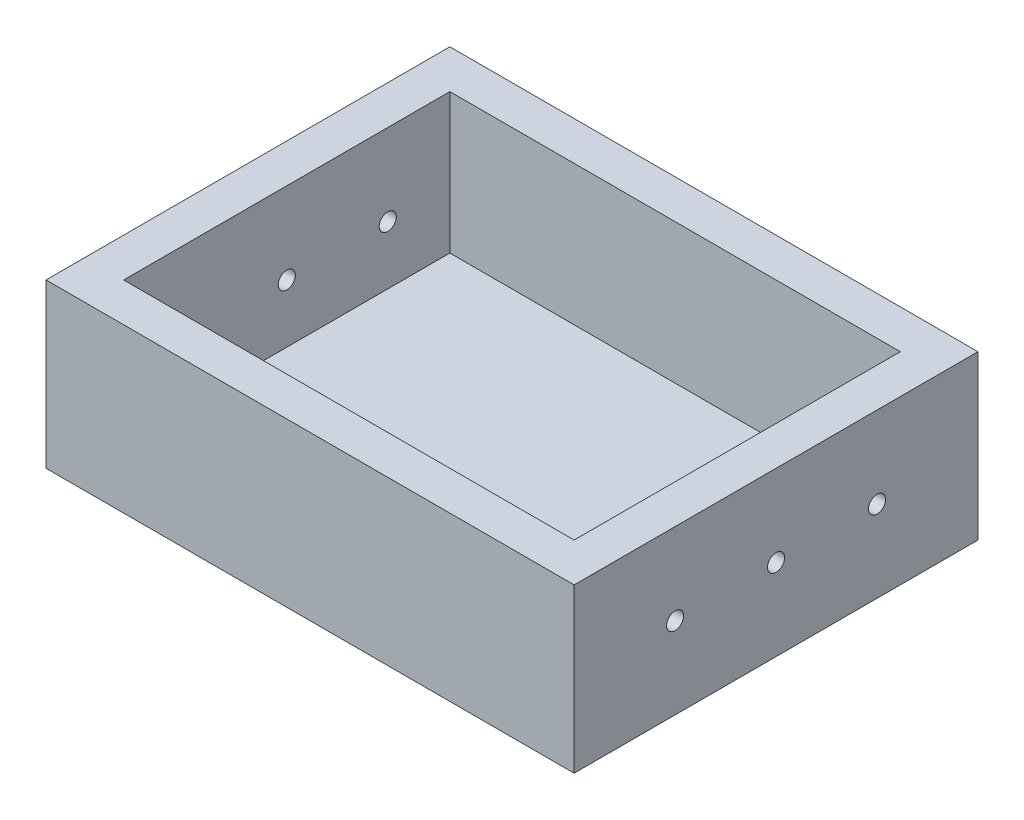
ISO-10303-21;
HEADER;
FILE_DESCRIPTION(('STEP AP214'),'2;1');
FILE_NAME('part.step','',(''),(''),'','','');
FILE_SCHEMA(('AUTOMOTIVE_DESIGN { 1 0 10303 214 1 1 1 1 }'));
ENDSEC;
DATA;
#1=APPLICATION_CONTEXT('core data for automotive mechanical design processes');
#2=APPLICATION_PROTOCOL_DEFINITION('international standard','automotive_design',2000,#1);
#3=PRODUCT_CONTEXT('',#1,'mechanical');
#4=PRODUCT('Part','Part','',(#3));
#5=PRODUCT_RELATED_PRODUCT_CATEGORY('part','',(#4));
#6=PRODUCT_DEFINITION_FORMATION('','',#4);
#7=PRODUCT_DEFINITION_CONTEXT('part definition',#1,'design');
#8=PRODUCT_DEFINITION('design','',#6,#7);
#9=PRODUCT_DEFINITION_SHAPE('','',#8);
#10=(LENGTH_UNIT() NAMED_UNIT(*) SI_UNIT(.MILLI.,.METRE.));
#11=(NAMED_UNIT(*) PLANE_ANGLE_UNIT() SI_UNIT($,.RADIAN.));
#12=(NAMED_UNIT(*) SI_UNIT($,.STERADIAN.) SOLID_ANGLE_UNIT());
#13=UNCERTAINTY_MEASURE_WITH_UNIT(LENGTH_MEASURE(1.E-05),#10,'distance_accuracy_value','');
#14=(GEOMETRIC_REPRESENTATION_CONTEXT(3) GLOBAL_UNCERTAINTY_ASSIGNED_CONTEXT((#13)) GLOBAL_UNIT_ASSIGNED_CONTEXT((#10,
#11,#12)) REPRESENTATION_CONTEXT('',''));
#15=CARTESIAN_POINT('',(0.,0.,0.));
#16=DIRECTION('',(0.,0.,1.));
#17=DIRECTION('',(1.,0.,0.));
#18=AXIS2_PLACEMENT_3D('',#15,#16,#17);
#19=CARTESIAN_POINT('',(68.,42.,-52.));
#20=DIRECTION('',(-1.,0.,0.));
#21=DIRECTION('',(0.,0.,1.));
#22=AXIS2_PLACEMENT_3D('',#19,#20,#21);
#23=PLANE('',#22);
#24=CARTESIAN_POINT('',(68.,21.,-26.));
#25=DIRECTION('',(-1.,0.,0.));
#26=DIRECTION('',(0.,0.,1.));
#27=AXIS2_PLACEMENT_3D('',#24,#25,#26);
#28=CIRCLE('',#27,2.2);
#29=CARTESIAN_POINT('',(68.,21.,-23.8));
#30=VERTEX_POINT('',#29);
#31=EDGE_CURVE('E180',#30,#30,#28,.T.);
#32=ORIENTED_EDGE('',*,*,#31,.T.);
#33=EDGE_LOOP('',(#32));
#34=FACE_BOUND('',#33,.T.);
#35=CARTESIAN_POINT('',(68.,21.,26.));
#36=DIRECTION('',(-1.,0.,0.));
#37=DIRECTION('',(0.,0.,1.));
#38=AXIS2_PLACEMENT_3D('',#35,#36,#37);
#39=CIRCLE('',#38,2.2);
#40=CARTESIAN_POINT('',(68.,21.,28.2));
#41=VERTEX_POINT('',#40);
#42=EDGE_CURVE('E198',#41,#41,#39,.T.);
#43=ORIENTED_EDGE('',*,*,#42,.T.);
#44=EDGE_LOOP('',(#43));
#45=FACE_BOUND('',#44,.T.);
#46=CARTESIAN_POINT('',(68.,21.,0.));
#47=DIRECTION('',(-1.,0.,0.));
#48=DIRECTION('',(0.,0.,1.));
#49=AXIS2_PLACEMENT_3D('',#46,#47,#48);
#50=CIRCLE('',#49,2.2);
#51=CARTESIAN_POINT('',(68.,21.,2.19999999999999));
#52=VERTEX_POINT('',#51);
#53=EDGE_CURVE('E192',#52,#52,#50,.T.);
#54=ORIENTED_EDGE('',*,*,#53,.T.);
#55=EDGE_LOOP('',(#54));
#56=FACE_BOUND('',#55,.T.);
#57=DIRECTION('',(0.,0.,-1.));
#58=VECTOR('',#57,1.);
#59=CARTESIAN_POINT('',(68.,0.,-52.));
#60=LINE('',#59,#58);
#61=CARTESIAN_POINT('',(68.,0.,52.));
#62=VERTEX_POINT('',#61);
#63=CARTESIAN_POINT('',(68.,0.,-52.));
#64=VERTEX_POINT('',#63);
#65=EDGE_CURVE('E154',#62,#64,#60,.T.);
#66=ORIENTED_EDGE('',*,*,#65,.T.);
#67=DIRECTION('',(0.,-1.,0.));
#68=VECTOR('',#67,1.);
#69=CARTESIAN_POINT('',(68.,42.,-52.));
#70=LINE('',#69,#68);
#71=CARTESIAN_POINT('',(68.,42.,-52.));
#72=VERTEX_POINT('',#71);
#73=EDGE_CURVE('E11',#72,#64,#70,.T.);
#74=ORIENTED_EDGE('',*,*,#73,.F.);
#75=DIRECTION('',(0.,0.,-1.));
#76=VECTOR('',#75,1.);
#77=CARTESIAN_POINT('',(68.,42.,-52.));
#78=LINE('',#77,#76);
#79=CARTESIAN_POINT('',(68.,42.,52.));
#80=VERTEX_POINT('',#79);
#81=EDGE_CURVE('E158',#80,#72,#78,.T.);
#82=ORIENTED_EDGE('',*,*,#81,.F.);
#83=DIRECTION('',(0.,-1.,0.));
#84=VECTOR('',#83,1.);
#85=CARTESIAN_POINT('',(68.,42.,52.));
#86=LINE('',#85,#84);
#87=EDGE_CURVE('E164',#80,#62,#86,.T.);
#88=ORIENTED_EDGE('',*,*,#87,.T.);
#89=EDGE_LOOP('',(#66,#74,#82,#88));
#90=FACE_BOUND('',#89,.T.);
#91=ADVANCED_FACE('F41',(#34,#45,#56,#90),#23,.F.);
#92=CARTESIAN_POINT('',(-68.,42.,-52.));
#93=DIRECTION('',(0.,0.,1.));
#94=DIRECTION('',(1.,0.,0.));
#95=AXIS2_PLACEMENT_3D('',#92,#93,#94);
#96=PLANE('',#95);
#97=DIRECTION('',(-1.,0.,0.));
#98=VECTOR('',#97,1.);
#99=CARTESIAN_POINT('',(-68.,0.,-52.));
#100=LINE('',#99,#98);
#101=CARTESIAN_POINT('',(-68.,0.,-52.));
#102=VERTEX_POINT('',#101);
#103=EDGE_CURVE('E167',#64,#102,#100,.T.);
#104=ORIENTED_EDGE('',*,*,#103,.T.);
#105=DIRECTION('',(0.,-1.,0.));
#106=VECTOR('',#105,1.);
#107=CARTESIAN_POINT('',(-68.,42.,-52.));
#108=LINE('',#107,#106);
#109=CARTESIAN_POINT('',(-68.,42.,-52.));
#110=VERTEX_POINT('',#109);
#111=EDGE_CURVE('E49',#110,#102,#108,.T.);
#112=ORIENTED_EDGE('',*,*,#111,.F.);
#113=DIRECTION('',(-1.,0.,0.));
#114=VECTOR('',#113,1.);
#115=CARTESIAN_POINT('',(-68.,42.,-52.));
#116=LINE('',#115,#114);
#117=EDGE_CURVE('E94',#72,#110,#116,.T.);
#118=ORIENTED_EDGE('',*,*,#117,.F.);
#119=ORIENTED_EDGE('',*,*,#73,.T.);
#120=EDGE_LOOP('',(#104,#112,#118,#119));
#121=FACE_BOUND('',#120,.T.);
#122=ADVANCED_FACE('F240',(#121),#96,.F.);
#123=CARTESIAN_POINT('',(-68.,42.,-52.));
#124=DIRECTION('',(1.,0.,0.));
#125=DIRECTION('',(0.,0.,-1.));
#126=AXIS2_PLACEMENT_3D('',#123,#124,#125);
#127=PLANE('',#126);
#128=CARTESIAN_POINT('',(-68.,21.,-26.));
#129=DIRECTION('',(-1.,0.,0.));
#130=DIRECTION('',(0.,0.,1.));
#131=AXIS2_PLACEMENT_3D('',#128,#129,#130);
#132=CIRCLE('',#131,2.2);
#133=CARTESIAN_POINT('',(-68.,21.,-23.8));
#134=VERTEX_POINT('',#133);
#135=EDGE_CURVE('E204',#134,#134,#132,.T.);
#136=ORIENTED_EDGE('',*,*,#135,.F.);
#137=EDGE_LOOP('',(#136));
#138=FACE_BOUND('',#137,.T.);
#139=CARTESIAN_POINT('',(-68.,21.,26.));
#140=DIRECTION('',(-1.,0.,0.));
#141=DIRECTION('',(0.,0.,1.));
#142=AXIS2_PLACEMENT_3D('',#139,#140,#141);
#143=CIRCLE('',#142,2.2);
#144=CARTESIAN_POINT('',(-68.,21.,28.2));
#145=VERTEX_POINT('',#144);
#146=EDGE_CURVE('E201',#145,#145,#143,.T.);
#147=ORIENTED_EDGE('',*,*,#146,.F.);
#148=EDGE_LOOP('',(#147));
#149=FACE_BOUND('',#148,.T.);
#150=CARTESIAN_POINT('',(-68.,21.,0.));
#151=DIRECTION('',(-1.,0.,0.));
#152=DIRECTION('',(0.,0.,1.));
#153=AXIS2_PLACEMENT_3D('',#150,#151,#152);
#154=CIRCLE('',#153,2.2);
#155=CARTESIAN_POINT('',(-68.,21.,2.19999999999999));
#156=VERTEX_POINT('',#155);
#157=EDGE_CURVE('E195',#156,#156,#154,.T.);
#158=ORIENTED_EDGE('',*,*,#157,.F.);
#159=EDGE_LOOP('',(#158));
#160=FACE_BOUND('',#159,.T.);
#161=DIRECTION('',(0.,0.,1.));
#162=VECTOR('',#161,1.);
#163=CARTESIAN_POINT('',(-68.,0.,-52.));
#164=LINE('',#163,#162);
#165=CARTESIAN_POINT('',(-68.,0.,52.));
#166=VERTEX_POINT('',#165);
#167=EDGE_CURVE('E169',#102,#166,#164,.T.);
#168=ORIENTED_EDGE('',*,*,#167,.T.);
#169=DIRECTION('',(0.,-1.,0.));
#170=VECTOR('',#169,1.);
#171=CARTESIAN_POINT('',(-68.,42.,52.));
#172=LINE('',#171,#170);
#173=CARTESIAN_POINT('',(-68.,42.,52.));
#174=VERTEX_POINT('',#173);
#175=EDGE_CURVE('E173',#174,#166,#172,.T.);
#176=ORIENTED_EDGE('',*,*,#175,.F.);
#177=DIRECTION('',(0.,0.,1.));
#178=VECTOR('',#177,1.);
#179=CARTESIAN_POINT('',(-68.,42.,-52.));
#180=LINE('',#179,#178);
#181=EDGE_CURVE('E161',#110,#174,#180,.T.);
#182=ORIENTED_EDGE('',*,*,#181,.F.);
#183=ORIENTED_EDGE('',*,*,#111,.T.);
#184=EDGE_LOOP('',(#168,#176,#182,#183));
#185=FACE_BOUND('',#184,.T.);
#186=ADVANCED_FACE('F246',(#138,#149,#160,#185),#127,.F.);
#187=CARTESIAN_POINT('',(-68.,42.,52.));
#188=DIRECTION('',(0.,0.,-1.));
#189=DIRECTION('',(-1.,0.,0.));
#190=AXIS2_PLACEMENT_3D('',#187,#188,#189);
#191=PLANE('',#190);
#192=DIRECTION('',(1.,0.,0.));
#193=VECTOR('',#192,1.);
#194=CARTESIAN_POINT('',(-68.,0.,52.));
#195=LINE('',#194,#193);
#196=EDGE_CURVE('E87',#166,#62,#195,.T.);
#197=ORIENTED_EDGE('',*,*,#196,.T.);
#198=ORIENTED_EDGE('',*,*,#87,.F.);
#199=DIRECTION('',(1.,0.,0.));
#200=VECTOR('',#199,1.);
#201=CARTESIAN_POINT('',(-68.,42.,52.));
#202=LINE('',#201,#200);
#203=EDGE_CURVE('E66',#174,#80,#202,.T.);
#204=ORIENTED_EDGE('',*,*,#203,.F.);
#205=ORIENTED_EDGE('',*,*,#175,.T.);
#206=EDGE_LOOP('',(#197,#198,#204,#205));
#207=FACE_BOUND('',#206,.T.);
#208=ADVANCED_FACE('F250',(#207),#191,.F.);
#209=CARTESIAN_POINT('',(0.,42.,0.));
#210=DIRECTION('',(0.,1.,0.));
#211=DIRECTION('',(0.,0.,1.));
#212=AXIS2_PLACEMENT_3D('',#209,#210,#211);
#213=PLANE('',#212);
#214=DIRECTION('',(0.,0.,-1.));
#215=VECTOR('',#214,1.);
#216=CARTESIAN_POINT('',(58.,42.,-42.));
#217=LINE('',#216,#215);
#218=CARTESIAN_POINT('',(58.,42.,42.));
#219=VERTEX_POINT('',#218);
#220=CARTESIAN_POINT('',(58.,42.,-42.));
#221=VERTEX_POINT('',#220);
#222=EDGE_CURVE('E57',#219,#221,#217,.T.);
#223=ORIENTED_EDGE('',*,*,#222,.F.);
#224=DIRECTION('',(1.,0.,0.));
#225=VECTOR('',#224,1.);
#226=CARTESIAN_POINT('',(-58.,42.,42.));
#227=LINE('',#226,#225);
#228=CARTESIAN_POINT('',(-58.,42.,42.));
#229=VERTEX_POINT('',#228);
#230=EDGE_CURVE('E136',#229,#219,#227,.T.);
#231=ORIENTED_EDGE('',*,*,#230,.F.);
#232=DIRECTION('',(0.,0.,1.));
#233=VECTOR('',#232,1.);
#234=CARTESIAN_POINT('',(-58.,42.,-42.));
#235=LINE('',#234,#233);
#236=CARTESIAN_POINT('',(-58.,42.,-42.));
#237=VERTEX_POINT('',#236);
#238=EDGE_CURVE('E139',#237,#229,#235,.T.);
#239=ORIENTED_EDGE('',*,*,#238,.F.);
#240=DIRECTION('',(-1.,0.,0.));
#241=VECTOR('',#240,1.);
#242=CARTESIAN_POINT('',(-58.,42.,-42.));
#243=LINE('',#242,#241);
#244=EDGE_CURVE('E148',#221,#237,#243,.T.);
#245=ORIENTED_EDGE('',*,*,#244,.F.);
#246=EDGE_LOOP('',(#223,#231,#239,#245));
#247=FACE_BOUND('',#246,.T.);
#248=ORIENTED_EDGE('',*,*,#81,.T.);
#249=ORIENTED_EDGE('',*,*,#117,.T.);
#250=ORIENTED_EDGE('',*,*,#181,.T.);
#251=ORIENTED_EDGE('',*,*,#203,.T.);
#252=EDGE_LOOP('',(#248,#249,#250,#251));
#253=FACE_BOUND('',#252,.T.);
#254=ADVANCED_FACE('F255',(#247,#253),#213,.T.);
#255=CARTESIAN_POINT('',(0.,0.,0.));
#256=DIRECTION('',(0.,1.,0.));
#257=DIRECTION('',(0.,0.,1.));
#258=AXIS2_PLACEMENT_3D('',#255,#256,#257);
#259=PLANE('',#258);
#260=ORIENTED_EDGE('',*,*,#65,.F.);
#261=ORIENTED_EDGE('',*,*,#196,.F.);
#262=ORIENTED_EDGE('',*,*,#167,.F.);
#263=ORIENTED_EDGE('',*,*,#103,.F.);
#264=EDGE_LOOP('',(#260,#261,#262,#263));
#265=FACE_BOUND('',#264,.T.);
#266=ADVANCED_FACE('F256',(#265),#259,.F.);
#267=CARTESIAN_POINT('',(58.,6.00000000000001,-42.));
#268=DIRECTION('',(1.,0.,0.));
#269=DIRECTION('',(0.,0.,-1.));
#270=AXIS2_PLACEMENT_3D('',#267,#268,#269);
#271=PLANE('',#270);
#272=CARTESIAN_POINT('',(58.,21.,-26.));
#273=DIRECTION('',(1.,0.,0.));
#274=DIRECTION('',(0.,0.,-1.));
#275=AXIS2_PLACEMENT_3D('',#272,#273,#274);
#276=CIRCLE('',#275,2.2);
#277=CARTESIAN_POINT('',(58.,21.,-28.2));
#278=VERTEX_POINT('',#277);
#279=EDGE_CURVE('E142',#278,#278,#276,.T.);
#280=ORIENTED_EDGE('',*,*,#279,.T.);
#281=EDGE_LOOP('',(#280));
#282=FACE_BOUND('',#281,.T.);
#283=CARTESIAN_POINT('',(58.,21.,26.));
#284=DIRECTION('',(1.,0.,0.));
#285=DIRECTION('',(0.,0.,-1.));
#286=AXIS2_PLACEMENT_3D('',#283,#284,#285);
#287=CIRCLE('',#286,2.2);
#288=CARTESIAN_POINT('',(58.,21.,23.8));
#289=VERTEX_POINT('',#288);
#290=EDGE_CURVE('E183',#289,#289,#287,.T.);
#291=ORIENTED_EDGE('',*,*,#290,.T.);
#292=EDGE_LOOP('',(#291));
#293=FACE_BOUND('',#292,.T.);
#294=CARTESIAN_POINT('',(58.,21.,0.));
#295=DIRECTION('',(1.,0.,0.));
#296=DIRECTION('',(0.,0.,-1.));
#297=AXIS2_PLACEMENT_3D('',#294,#295,#296);
#298=CIRCLE('',#297,2.2);
#299=CARTESIAN_POINT('',(58.,21.,-2.20000000000001));
#300=VERTEX_POINT('',#299);
#301=EDGE_CURVE('E179',#300,#300,#298,.T.);
#302=ORIENTED_EDGE('',*,*,#301,.T.);
#303=EDGE_LOOP('',(#302));
#304=FACE_BOUND('',#303,.T.);
#305=ORIENTED_EDGE('',*,*,#222,.T.);
#306=DIRECTION('',(0.,1.,0.));
#307=VECTOR('',#306,1.);
#308=CARTESIAN_POINT('',(58.,6.00000000000001,-42.));
#309=LINE('',#308,#307);
#310=CARTESIAN_POINT('',(58.,6.00000000000001,-42.));
#311=VERTEX_POINT('',#310);
#312=EDGE_CURVE('E114',#311,#221,#309,.T.);
#313=ORIENTED_EDGE('',*,*,#312,.F.);
#314=DIRECTION('',(0.,0.,-1.));
#315=VECTOR('',#314,1.);
#316=CARTESIAN_POINT('',(58.,6.00000000000001,-42.));
#317=LINE('',#316,#315);
#318=CARTESIAN_POINT('',(58.,6.00000000000001,42.));
#319=VERTEX_POINT('',#318);
#320=EDGE_CURVE('E118',#319,#311,#317,.T.);
#321=ORIENTED_EDGE('',*,*,#320,.F.);
#322=DIRECTION('',(0.,1.,0.));
#323=VECTOR('',#322,1.);
#324=CARTESIAN_POINT('',(58.,6.00000000000001,42.));
#325=LINE('',#324,#323);
#326=EDGE_CURVE('E152',#319,#219,#325,.T.);
#327=ORIENTED_EDGE('',*,*,#326,.T.);
#328=EDGE_LOOP('',(#305,#313,#321,#327));
#329=FACE_BOUND('',#328,.T.);
#330=ADVANCED_FACE('F116',(#282,#293,#304,#329),#271,.F.);
#331=CARTESIAN_POINT('',(-58.,6.00000000000001,42.));
#332=DIRECTION('',(0.,0.,1.));
#333=DIRECTION('',(1.,0.,0.));
#334=AXIS2_PLACEMENT_3D('',#331,#332,#333);
#335=PLANE('',#334);
#336=ORIENTED_EDGE('',*,*,#230,.T.);
#337=ORIENTED_EDGE('',*,*,#326,.F.);
#338=DIRECTION('',(1.,0.,0.));
#339=VECTOR('',#338,1.);
#340=CARTESIAN_POINT('',(-58.,6.00000000000001,42.));
#341=LINE('',#340,#339);
#342=CARTESIAN_POINT('',(-58.,6.00000000000001,42.));
#343=VERTEX_POINT('',#342);
#344=EDGE_CURVE('E124',#343,#319,#341,.T.);
#345=ORIENTED_EDGE('',*,*,#344,.F.);
#346=DIRECTION('',(0.,1.,0.));
#347=VECTOR('',#346,1.);
#348=CARTESIAN_POINT('',(-58.,6.00000000000001,42.));
#349=LINE('',#348,#347);
#350=EDGE_CURVE('E155',#343,#229,#349,.T.);
#351=ORIENTED_EDGE('',*,*,#350,.T.);
#352=EDGE_LOOP('',(#336,#337,#345,#351));
#353=FACE_BOUND('',#352,.T.);
#354=ADVANCED_FACE('F265',(#353),#335,.F.);
#355=CARTESIAN_POINT('',(-58.,6.00000000000001,-42.));
#356=DIRECTION('',(-1.,0.,0.));
#357=DIRECTION('',(0.,0.,1.));
#358=AXIS2_PLACEMENT_3D('',#355,#356,#357);
#359=PLANE('',#358);
#360=CARTESIAN_POINT('',(-58.,21.,-26.));
#361=DIRECTION('',(-1.,0.,0.));
#362=DIRECTION('',(0.,0.,1.));
#363=AXIS2_PLACEMENT_3D('',#360,#361,#362);
#364=CIRCLE('',#363,2.2);
#365=CARTESIAN_POINT('',(-58.,21.,-23.8));
#366=VERTEX_POINT('',#365);
#367=EDGE_CURVE('E44',#366,#366,#364,.T.);
#368=ORIENTED_EDGE('',*,*,#367,.T.);
#369=EDGE_LOOP('',(#368));
#370=FACE_BOUND('',#369,.T.);
#371=CARTESIAN_POINT('',(-58.,21.,26.));
#372=DIRECTION('',(-1.,0.,0.));
#373=DIRECTION('',(0.,0.,1.));
#374=AXIS2_PLACEMENT_3D('',#371,#372,#373);
#375=CIRCLE('',#374,2.2);
#376=CARTESIAN_POINT('',(-58.,21.,28.2));
#377=VERTEX_POINT('',#376);
#378=EDGE_CURVE('E181',#377,#377,#375,.T.);
#379=ORIENTED_EDGE('',*,*,#378,.T.);
#380=EDGE_LOOP('',(#379));
#381=FACE_BOUND('',#380,.T.);
#382=CARTESIAN_POINT('',(-58.,21.,0.));
#383=DIRECTION('',(-1.,0.,0.));
#384=DIRECTION('',(0.,0.,1.));
#385=AXIS2_PLACEMENT_3D('',#382,#383,#384);
#386=CIRCLE('',#385,2.2);
#387=CARTESIAN_POINT('',(-58.,21.,2.19999999999999));
#388=VERTEX_POINT('',#387);
#389=EDGE_CURVE('E177',#388,#388,#386,.T.);
#390=ORIENTED_EDGE('',*,*,#389,.T.);
#391=EDGE_LOOP('',(#390));
#392=FACE_BOUND('',#391,.T.);
#393=ORIENTED_EDGE('',*,*,#238,.T.);
#394=ORIENTED_EDGE('',*,*,#350,.F.);
#395=DIRECTION('',(0.,0.,1.));
#396=VECTOR('',#395,1.);
#397=CARTESIAN_POINT('',(-58.,6.00000000000001,-42.));
#398=LINE('',#397,#396);
#399=CARTESIAN_POINT('',(-58.,6.00000000000001,-42.));
#400=VERTEX_POINT('',#399);
#401=EDGE_CURVE('E132',#400,#343,#398,.T.);
#402=ORIENTED_EDGE('',*,*,#401,.F.);
#403=DIRECTION('',(0.,1.,0.));
#404=VECTOR('',#403,1.);
#405=CARTESIAN_POINT('',(-58.,6.00000000000001,-42.));
#406=LINE('',#405,#404);
#407=EDGE_CURVE('E123',#400,#237,#406,.T.);
#408=ORIENTED_EDGE('',*,*,#407,.T.);
#409=EDGE_LOOP('',(#393,#394,#402,#408));
#410=FACE_BOUND('',#409,.T.);
#411=ADVANCED_FACE('F224',(#370,#381,#392,#410),#359,.F.);
#412=CARTESIAN_POINT('',(-58.,6.00000000000001,-42.));
#413=DIRECTION('',(0.,0.,-1.));
#414=DIRECTION('',(-1.,0.,0.));
#415=AXIS2_PLACEMENT_3D('',#412,#413,#414);
#416=PLANE('',#415);
#417=ORIENTED_EDGE('',*,*,#244,.T.);
#418=ORIENTED_EDGE('',*,*,#407,.F.);
#419=DIRECTION('',(-1.,0.,0.));
#420=VECTOR('',#419,1.);
#421=CARTESIAN_POINT('',(-58.,6.00000000000001,-42.));
#422=LINE('',#421,#420);
#423=EDGE_CURVE('E127',#311,#400,#422,.T.);
#424=ORIENTED_EDGE('',*,*,#423,.F.);
#425=ORIENTED_EDGE('',*,*,#312,.T.);
#426=EDGE_LOOP('',(#417,#418,#424,#425));
#427=FACE_BOUND('',#426,.T.);
#428=ADVANCED_FACE('F128',(#427),#416,.F.);
#429=CARTESIAN_POINT('',(0.,6.00000000000001,0.));
#430=DIRECTION('',(0.,1.,0.));
#431=DIRECTION('',(0.,0.,1.));
#432=AXIS2_PLACEMENT_3D('',#429,#430,#431);
#433=PLANE('',#432);
#434=ORIENTED_EDGE('',*,*,#320,.T.);
#435=ORIENTED_EDGE('',*,*,#423,.T.);
#436=ORIENTED_EDGE('',*,*,#401,.T.);
#437=ORIENTED_EDGE('',*,*,#344,.T.);
#438=EDGE_LOOP('',(#434,#435,#436,#437));
#439=FACE_BOUND('',#438,.T.);
#440=ADVANCED_FACE('F134',(#439),#433,.T.);
#441=CARTESIAN_POINT('',(68.,21.,0.));
#442=DIRECTION('',(-1.,0.,0.));
#443=DIRECTION('',(0.,0.,1.));
#444=AXIS2_PLACEMENT_3D('',#441,#442,#443);
#445=CYLINDRICAL_SURFACE('',#444,2.2);
#446=ORIENTED_EDGE('',*,*,#157,.T.);
#447=EDGE_LOOP('',(#446));
#448=FACE_BOUND('',#447,.T.);
#449=ORIENTED_EDGE('',*,*,#389,.F.);
#450=EDGE_LOOP('',(#449));
#451=FACE_BOUND('',#450,.T.);
#452=ADVANCED_FACE('F236',(#448,#451),#445,.F.);
#453=CARTESIAN_POINT('',(68.,21.,26.));
#454=DIRECTION('',(-1.,0.,0.));
#455=DIRECTION('',(0.,0.,1.));
#456=AXIS2_PLACEMENT_3D('',#453,#454,#455);
#457=CYLINDRICAL_SURFACE('',#456,2.2);
#458=ORIENTED_EDGE('',*,*,#146,.T.);
#459=EDGE_LOOP('',(#458));
#460=FACE_BOUND('',#459,.T.);
#461=ORIENTED_EDGE('',*,*,#378,.F.);
#462=EDGE_LOOP('',(#461));
#463=FACE_BOUND('',#462,.T.);
#464=ADVANCED_FACE('F228',(#460,#463),#457,.F.);
#465=CARTESIAN_POINT('',(68.,21.,-26.));
#466=DIRECTION('',(-1.,0.,0.));
#467=DIRECTION('',(0.,0.,1.));
#468=AXIS2_PLACEMENT_3D('',#465,#466,#467);
#469=CYLINDRICAL_SURFACE('',#468,2.2);
#470=ORIENTED_EDGE('',*,*,#135,.T.);
#471=EDGE_LOOP('',(#470));
#472=FACE_BOUND('',#471,.T.);
#473=ORIENTED_EDGE('',*,*,#367,.F.);
#474=EDGE_LOOP('',(#473));
#475=FACE_BOUND('',#474,.T.);
#476=ADVANCED_FACE('F217',(#472,#475),#469,.F.);
#477=ORIENTED_EDGE('',*,*,#53,.F.);
#478=EDGE_LOOP('',(#477));
#479=FACE_BOUND('',#478,.T.);
#480=ORIENTED_EDGE('',*,*,#301,.F.);
#481=EDGE_LOOP('',(#480));
#482=FACE_BOUND('',#481,.T.);
#483=ADVANCED_FACE('F227',(#479,#482),#445,.F.);
#484=ORIENTED_EDGE('',*,*,#42,.F.);
#485=EDGE_LOOP('',(#484));
#486=FACE_BOUND('',#485,.T.);
#487=ORIENTED_EDGE('',*,*,#290,.F.);
#488=EDGE_LOOP('',(#487));
#489=FACE_BOUND('',#488,.T.);
#490=ADVANCED_FACE('F215',(#486,#489),#457,.F.);
#491=ORIENTED_EDGE('',*,*,#31,.F.);
#492=EDGE_LOOP('',(#491));
#493=FACE_BOUND('',#492,.T.);
#494=ORIENTED_EDGE('',*,*,#279,.F.);
#495=EDGE_LOOP('',(#494));
#496=FACE_BOUND('',#495,.T.);
#497=ADVANCED_FACE('F212',(#493,#496),#469,.F.);
#498=CLOSED_SHELL('',(#91,#122,#186,#208,#254,#266,#330,#354,#411,#428,#440,#452,#464,#476,#483,
#490,#497));
#499=MANIFOLD_SOLID_BREP('B2',#498);
#500=ADVANCED_BREP_SHAPE_REPRESENTATION('',(#18,#499),#14);
#501=SHAPE_DEFINITION_REPRESENTATION(#9,#500);
ENDSEC;
END-ISO-10303-21;
